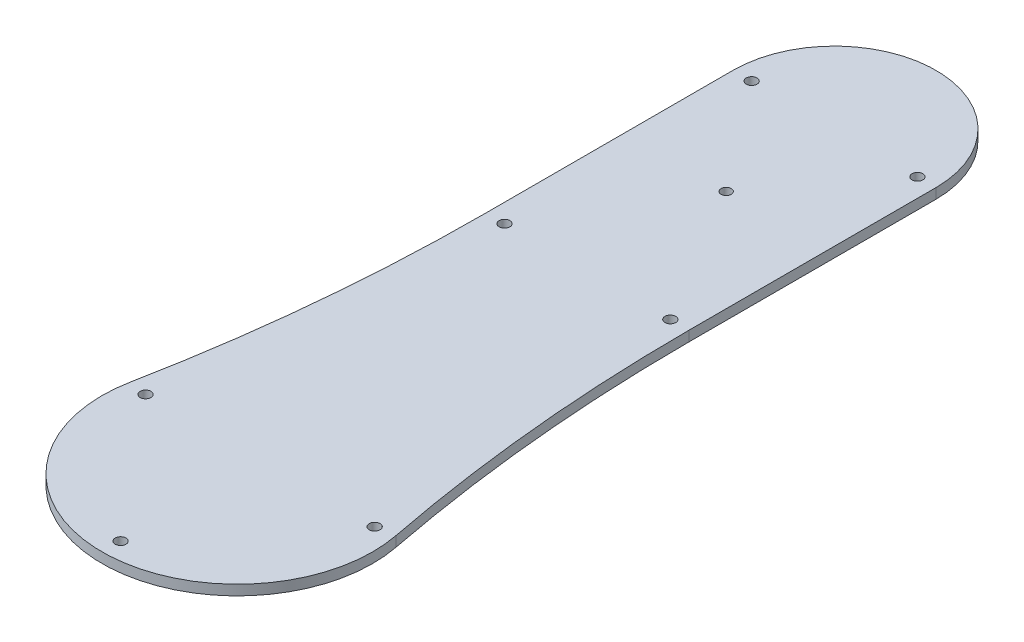
ISO-10303-21;
HEADER;
FILE_DESCRIPTION(('STEP AP214'),'2;1');
FILE_NAME('part.step','',(''),(''),'','','');
FILE_SCHEMA(('AUTOMOTIVE_DESIGN { 1 0 10303 214 1 1 1 1 }'));
ENDSEC;
DATA;
#1=APPLICATION_CONTEXT('core data for automotive mechanical design processes');
#2=APPLICATION_PROTOCOL_DEFINITION('international standard','automotive_design',2000,#1);
#3=PRODUCT_CONTEXT('',#1,'mechanical');
#4=PRODUCT('Part','Part','',(#3));
#5=PRODUCT_RELATED_PRODUCT_CATEGORY('part','',(#4));
#6=PRODUCT_DEFINITION_FORMATION('','',#4);
#7=PRODUCT_DEFINITION_CONTEXT('part definition',#1,'design');
#8=PRODUCT_DEFINITION('design','',#6,#7);
#9=PRODUCT_DEFINITION_SHAPE('','',#8);
#10=(LENGTH_UNIT() NAMED_UNIT(*) SI_UNIT(.MILLI.,.METRE.));
#11=(NAMED_UNIT(*) PLANE_ANGLE_UNIT() SI_UNIT($,.RADIAN.));
#12=(NAMED_UNIT(*) SI_UNIT($,.STERADIAN.) SOLID_ANGLE_UNIT());
#13=UNCERTAINTY_MEASURE_WITH_UNIT(LENGTH_MEASURE(1.E-05),#10,'distance_accuracy_value','');
#14=(GEOMETRIC_REPRESENTATION_CONTEXT(3) GLOBAL_UNCERTAINTY_ASSIGNED_CONTEXT((#13)) GLOBAL_UNIT_ASSIGNED_CONTEXT((#10,
#11,#12)) REPRESENTATION_CONTEXT('',''));
#15=CARTESIAN_POINT('',(0.,0.,0.));
#16=DIRECTION('',(0.,0.,1.));
#17=DIRECTION('',(1.,0.,0.));
#18=AXIS2_PLACEMENT_3D('',#15,#16,#17);
#19=CARTESIAN_POINT('',(-530.000000000004,3.,-103.440804327867));
#20=DIRECTION('',(0.,-1.,0.));
#21=DIRECTION('',(0.,0.,-1.));
#22=AXIS2_PLACEMENT_3D('',#19,#20,#21);
#23=CYLINDRICAL_SURFACE('',#22,500.);
#24=CARTESIAN_POINT('',(-530.000000000004,0.,-103.440804327867));
#25=DIRECTION('',(0.,-1.,0.));
#26=DIRECTION('',(0.,0.,-1.));
#27=AXIS2_PLACEMENT_3D('',#24,#25,#26);
#28=CIRCLE('',#27,500.);
#29=CARTESIAN_POINT('',(-30.0000000000037,0.,-103.440804327867));
#30=VERTEX_POINT('',#29);
#31=CARTESIAN_POINT('',(-39.2592592592595,0.,-7.66228180206424));
#32=VERTEX_POINT('',#31);
#33=EDGE_CURVE('E128',#30,#32,#28,.T.);
#34=ORIENTED_EDGE('',*,*,#33,.T.);
#35=DIRECTION('',(0.,-1.,0.));
#36=VECTOR('',#35,1.);
#37=CARTESIAN_POINT('',(-39.2592592592595,3.,-7.66228180206424));
#38=LINE('',#37,#36);
#39=CARTESIAN_POINT('',(-39.2592592592595,3.,-7.66228180206424));
#40=VERTEX_POINT('',#39);
#41=EDGE_CURVE('E11',#40,#32,#38,.T.);
#42=ORIENTED_EDGE('',*,*,#41,.F.);
#43=CARTESIAN_POINT('',(-530.000000000004,3.,-103.440804327867));
#44=DIRECTION('',(0.,-1.,0.));
#45=DIRECTION('',(0.,0.,-1.));
#46=AXIS2_PLACEMENT_3D('',#43,#44,#45);
#47=CIRCLE('',#46,500.);
#48=CARTESIAN_POINT('',(-30.0000000000037,3.,-103.440804327867));
#49=VERTEX_POINT('',#48);
#50=EDGE_CURVE('E139',#49,#40,#47,.T.);
#51=ORIENTED_EDGE('',*,*,#50,.F.);
#52=DIRECTION('',(0.,-1.,0.));
#53=VECTOR('',#52,1.);
#54=CARTESIAN_POINT('',(-30.0000000000037,3.,-103.440804327867));
#55=LINE('',#54,#53);
#56=EDGE_CURVE('E124',#49,#30,#55,.T.);
#57=ORIENTED_EDGE('',*,*,#56,.T.);
#58=EDGE_LOOP('',(#34,#42,#51,#57));
#59=FACE_BOUND('',#58,.T.);
#60=ADVANCED_FACE('F43',(#59),#23,.F.);
#61=CARTESIAN_POINT('',(0.,3.,0.));
#62=DIRECTION('',(0.,-1.,0.));
#63=DIRECTION('',(0.,0.,-1.));
#64=AXIS2_PLACEMENT_3D('',#61,#62,#63);
#65=CYLINDRICAL_SURFACE('',#64,40.);
#66=CARTESIAN_POINT('',(0.,0.,0.));
#67=DIRECTION('',(0.,1.,0.));
#68=DIRECTION('',(0.,0.,1.));
#69=AXIS2_PLACEMENT_3D('',#66,#67,#68);
#70=CIRCLE('',#69,40.);
#71=CARTESIAN_POINT('',(39.2592592592595,0.,-7.66228180206448));
#72=VERTEX_POINT('',#71);
#73=EDGE_CURVE('E131',#32,#72,#70,.T.);
#74=ORIENTED_EDGE('',*,*,#73,.T.);
#75=DIRECTION('',(0.,-1.,0.));
#76=VECTOR('',#75,1.);
#77=CARTESIAN_POINT('',(39.2592592592595,3.,-7.66228180206448));
#78=LINE('',#77,#76);
#79=CARTESIAN_POINT('',(39.2592592592595,3.,-7.66228180206448));
#80=VERTEX_POINT('',#79);
#81=EDGE_CURVE('E52',#80,#72,#78,.T.);
#82=ORIENTED_EDGE('',*,*,#81,.F.);
#83=CARTESIAN_POINT('',(0.,3.,0.));
#84=DIRECTION('',(0.,1.,0.));
#85=DIRECTION('',(0.,0.,1.));
#86=AXIS2_PLACEMENT_3D('',#83,#84,#85);
#87=CIRCLE('',#86,40.);
#88=EDGE_CURVE('E97',#40,#80,#87,.T.);
#89=ORIENTED_EDGE('',*,*,#88,.F.);
#90=ORIENTED_EDGE('',*,*,#41,.T.);
#91=EDGE_LOOP('',(#74,#82,#89,#90));
#92=FACE_BOUND('',#91,.T.);
#93=ADVANCED_FACE('F166',(#92),#65,.T.);
#94=CARTESIAN_POINT('',(530.000000000003,3.,-103.440804327872));
#95=DIRECTION('',(0.,-1.,0.));
#96=DIRECTION('',(0.,0.,-1.));
#97=AXIS2_PLACEMENT_3D('',#94,#95,#96);
#98=CYLINDRICAL_SURFACE('',#97,500.);
#99=CARTESIAN_POINT('',(530.000000000003,0.,-103.440804327872));
#100=DIRECTION('',(0.,-1.,0.));
#101=DIRECTION('',(0.,0.,-1.));
#102=AXIS2_PLACEMENT_3D('',#99,#100,#101);
#103=CIRCLE('',#102,500.);
#104=CARTESIAN_POINT('',(30.0000000000027,0.,-103.440804327872));
#105=VERTEX_POINT('',#104);
#106=EDGE_CURVE('E134',#72,#105,#103,.T.);
#107=ORIENTED_EDGE('',*,*,#106,.T.);
#108=DIRECTION('',(0.,-1.,0.));
#109=VECTOR('',#108,1.);
#110=CARTESIAN_POINT('',(30.0000000000027,3.,-103.440804327872));
#111=LINE('',#110,#109);
#112=CARTESIAN_POINT('',(30.0000000000027,3.,-103.440804327872));
#113=VERTEX_POINT('',#112);
#114=EDGE_CURVE('E119',#113,#105,#111,.T.);
#115=ORIENTED_EDGE('',*,*,#114,.F.);
#116=CARTESIAN_POINT('',(530.000000000003,3.,-103.440804327872));
#117=DIRECTION('',(0.,-1.,0.));
#118=DIRECTION('',(0.,0.,-1.));
#119=AXIS2_PLACEMENT_3D('',#116,#117,#118);
#120=CIRCLE('',#119,500.);
#121=EDGE_CURVE('E110',#80,#113,#120,.T.);
#122=ORIENTED_EDGE('',*,*,#121,.F.);
#123=ORIENTED_EDGE('',*,*,#81,.T.);
#124=EDGE_LOOP('',(#107,#115,#122,#123));
#125=FACE_BOUND('',#124,.T.);
#126=ADVANCED_FACE('F146',(#125),#98,.F.);
#127=CARTESIAN_POINT('',(30.0000000000027,3.,-176.457513110645));
#128=DIRECTION('',(-1.,0.,0.));
#129=DIRECTION('',(0.,0.,1.));
#130=AXIS2_PLACEMENT_3D('',#127,#128,#129);
#131=PLANE('',#130);
#132=DIRECTION('',(0.,0.,-1.));
#133=VECTOR('',#132,1.);
#134=CARTESIAN_POINT('',(30.0000000000027,0.,-176.457513110645));
#135=LINE('',#134,#133);
#136=CARTESIAN_POINT('',(30.0000000000039,0.,-176.457513110645));
#137=VERTEX_POINT('',#136);
#138=EDGE_CURVE('E118',#105,#137,#135,.T.);
#139=ORIENTED_EDGE('',*,*,#138,.T.);
#140=DIRECTION('',(0.,-1.,0.));
#141=VECTOR('',#140,1.);
#142=CARTESIAN_POINT('',(30.0000000000039,3.,-176.457513110645));
#143=LINE('',#142,#141);
#144=CARTESIAN_POINT('',(30.0000000000039,3.,-176.457513110645));
#145=VERTEX_POINT('',#144);
#146=EDGE_CURVE('E115',#145,#137,#143,.T.);
#147=ORIENTED_EDGE('',*,*,#146,.F.);
#148=DIRECTION('',(0.,0.,-1.));
#149=VECTOR('',#148,1.);
#150=CARTESIAN_POINT('',(30.0000000000027,3.,-176.457513110645));
#151=LINE('',#150,#149);
#152=EDGE_CURVE('E104',#113,#145,#151,.T.);
#153=ORIENTED_EDGE('',*,*,#152,.F.);
#154=ORIENTED_EDGE('',*,*,#114,.T.);
#155=EDGE_LOOP('',(#139,#147,#153,#154));
#156=FACE_BOUND('',#155,.T.);
#157=ADVANCED_FACE('F116',(#156),#131,.F.);
#158=CARTESIAN_POINT('',(7.32378567513958E-13,3.,-176.457513110645));
#159=DIRECTION('',(0.,-1.,0.));
#160=DIRECTION('',(0.,0.,-1.));
#161=AXIS2_PLACEMENT_3D('',#158,#159,#160);
#162=CYLINDRICAL_SURFACE('',#161,30.0000000000032);
#163=CARTESIAN_POINT('',(7.32378567513958E-13,0.,-176.457513110645));
#164=DIRECTION('',(0.,1.,0.));
#165=DIRECTION('',(0.,0.,1.));
#166=AXIS2_PLACEMENT_3D('',#163,#164,#165);
#167=CIRCLE('',#166,30.0000000000032);
#168=CARTESIAN_POINT('',(-30.0000000000037,0.,-176.457513110645));
#169=VERTEX_POINT('',#168);
#170=EDGE_CURVE('E83',#137,#169,#167,.T.);
#171=ORIENTED_EDGE('',*,*,#170,.T.);
#172=DIRECTION('',(0.,-1.,0.));
#173=VECTOR('',#172,1.);
#174=CARTESIAN_POINT('',(-30.0000000000037,3.,-176.457513110645));
#175=LINE('',#174,#173);
#176=CARTESIAN_POINT('',(-30.0000000000037,3.,-176.457513110645));
#177=VERTEX_POINT('',#176);
#178=EDGE_CURVE('E120',#177,#169,#175,.T.);
#179=ORIENTED_EDGE('',*,*,#178,.F.);
#180=CARTESIAN_POINT('',(7.32378567513958E-13,3.,-176.457513110645));
#181=DIRECTION('',(0.,1.,0.));
#182=DIRECTION('',(0.,0.,1.));
#183=AXIS2_PLACEMENT_3D('',#180,#181,#182);
#184=CIRCLE('',#183,30.0000000000032);
#185=EDGE_CURVE('E108',#145,#177,#184,.T.);
#186=ORIENTED_EDGE('',*,*,#185,.F.);
#187=ORIENTED_EDGE('',*,*,#146,.T.);
#188=EDGE_LOOP('',(#171,#179,#186,#187));
#189=FACE_BOUND('',#188,.T.);
#190=ADVANCED_FACE('F122',(#189),#162,.T.);
#191=CARTESIAN_POINT('',(-30.0000000000037,3.,-176.457513110645));
#192=DIRECTION('',(1.,0.,0.));
#193=DIRECTION('',(0.,0.,-1.));
#194=AXIS2_PLACEMENT_3D('',#191,#192,#193);
#195=PLANE('',#194);
#196=DIRECTION('',(0.,0.,1.));
#197=VECTOR('',#196,1.);
#198=CARTESIAN_POINT('',(-30.0000000000037,0.,-176.457513110645));
#199=LINE('',#198,#197);
#200=EDGE_CURVE('E89',#169,#30,#199,.T.);
#201=ORIENTED_EDGE('',*,*,#200,.T.);
#202=ORIENTED_EDGE('',*,*,#56,.F.);
#203=DIRECTION('',(0.,0.,1.));
#204=VECTOR('',#203,1.);
#205=CARTESIAN_POINT('',(-30.0000000000037,3.,-176.457513110645));
#206=LINE('',#205,#204);
#207=EDGE_CURVE('E60',#177,#49,#206,.T.);
#208=ORIENTED_EDGE('',*,*,#207,.F.);
#209=ORIENTED_EDGE('',*,*,#178,.T.);
#210=EDGE_LOOP('',(#201,#202,#208,#209));
#211=FACE_BOUND('',#210,.T.);
#212=ADVANCED_FACE('F153',(#211),#195,.F.);
#213=CARTESIAN_POINT('',(-530.000000000004,3.,-103.440804327867));
#214=DIRECTION('',(0.,-1.,0.));
#215=DIRECTION('',(0.,0.,-1.));
#216=AXIS2_PLACEMENT_3D('',#213,#214,#215);
#217=PLANE('',#216);
#218=CARTESIAN_POINT('',(1.08492693112868E-11,3.,-144.457513110647));
#219=DIRECTION('',(0.,1.,0.));
#220=DIRECTION('',(0.,0.,1.));
#221=AXIS2_PLACEMENT_3D('',#218,#219,#220);
#222=CIRCLE('',#221,1.5);
#223=CARTESIAN_POINT('',(1.08492693112868E-11,3.,-142.957513110647));
#224=VERTEX_POINT('',#223);
#225=EDGE_CURVE('E336',#224,#224,#222,.T.);
#226=ORIENTED_EDGE('',*,*,#225,.F.);
#227=EDGE_LOOP('',(#226));
#228=FACE_BOUND('',#227,.T.);
#229=CARTESIAN_POINT('',(6.57785458046956E-13,3.,34.5000000000004));
#230=DIRECTION('',(0.,1.,0.));
#231=DIRECTION('',(0.,0.,1.));
#232=AXIS2_PLACEMENT_3D('',#229,#230,#231);
#233=CIRCLE('',#232,1.6);
#234=CARTESIAN_POINT('',(6.57785458046956E-13,3.,36.1000000000004));
#235=VERTEX_POINT('',#234);
#236=EDGE_CURVE('E342',#235,#235,#233,.T.);
#237=ORIENTED_EDGE('',*,*,#236,.F.);
#238=EDGE_LOOP('',(#237));
#239=FACE_BOUND('',#238,.T.);
#240=CARTESIAN_POINT('',(-33.8424630414574,3.,-6.73080903707531));
#241=DIRECTION('',(0.,1.,0.));
#242=DIRECTION('',(0.,0.,-1.));
#243=AXIS2_PLACEMENT_3D('',#240,#241,#242);
#244=CIRCLE('',#243,1.6);
#245=CARTESIAN_POINT('',(-33.8424630414574,3.,-8.3308090370753));
#246=VERTEX_POINT('',#245);
#247=EDGE_CURVE('E353',#246,#246,#244,.T.);
#248=ORIENTED_EDGE('',*,*,#247,.F.);
#249=EDGE_LOOP('',(#248));
#250=FACE_BOUND('',#249,.T.);
#251=CARTESIAN_POINT('',(-24.5000544134384,3.,-103.453580765304));
#252=DIRECTION('',(0.,1.,0.));
#253=DIRECTION('',(0.,0.,-1.));
#254=AXIS2_PLACEMENT_3D('',#251,#252,#253);
#255=CIRCLE('',#254,1.6);
#256=CARTESIAN_POINT('',(-24.5000544134384,3.,-105.053580765304));
#257=VERTEX_POINT('',#256);
#258=EDGE_CURVE('E346',#257,#257,#255,.T.);
#259=ORIENTED_EDGE('',*,*,#258,.F.);
#260=EDGE_LOOP('',(#259));
#261=FACE_BOUND('',#260,.T.);
#262=CARTESIAN_POINT('',(-24.5000435594557,3.,-176.468944491205));
#263=DIRECTION('',(0.,1.,0.));
#264=DIRECTION('',(0.,0.,-1.));
#265=AXIS2_PLACEMENT_3D('',#262,#263,#264);
#266=CIRCLE('',#265,1.6);
#267=CARTESIAN_POINT('',(-24.5000435594557,3.,-178.068944491205));
#268=VERTEX_POINT('',#267);
#269=EDGE_CURVE('E375',#268,#268,#266,.T.);
#270=ORIENTED_EDGE('',*,*,#269,.F.);
#271=EDGE_LOOP('',(#270));
#272=FACE_BOUND('',#271,.T.);
#273=CARTESIAN_POINT('',(24.5000435594556,3.,-176.468944491205));
#274=DIRECTION('',(0.,1.,0.));
#275=DIRECTION('',(0.,0.,1.));
#276=AXIS2_PLACEMENT_3D('',#273,#274,#275);
#277=CIRCLE('',#276,1.6);
#278=CARTESIAN_POINT('',(24.5000435594556,3.,-174.868944491205));
#279=VERTEX_POINT('',#278);
#280=EDGE_CURVE('E369',#279,#279,#277,.T.);
#281=ORIENTED_EDGE('',*,*,#280,.F.);
#282=EDGE_LOOP('',(#281));
#283=FACE_BOUND('',#282,.T.);
#284=CARTESIAN_POINT('',(24.5000544134383,3.,-103.453580765304));
#285=DIRECTION('',(0.,1.,0.));
#286=DIRECTION('',(0.,0.,1.));
#287=AXIS2_PLACEMENT_3D('',#284,#285,#286);
#288=CIRCLE('',#287,1.6);
#289=CARTESIAN_POINT('',(24.5000544134383,3.,-101.853580765304));
#290=VERTEX_POINT('',#289);
#291=EDGE_CURVE('E363',#290,#290,#288,.T.);
#292=ORIENTED_EDGE('',*,*,#291,.F.);
#293=EDGE_LOOP('',(#292));
#294=FACE_BOUND('',#293,.T.);
#295=CARTESIAN_POINT('',(33.8424630414574,3.,-6.73080903707532));
#296=DIRECTION('',(0.,1.,0.));
#297=DIRECTION('',(0.,0.,1.));
#298=AXIS2_PLACEMENT_3D('',#295,#296,#297);
#299=CIRCLE('',#298,1.6);
#300=CARTESIAN_POINT('',(33.8424630414574,3.,-5.13080903707532));
#301=VERTEX_POINT('',#300);
#302=EDGE_CURVE('E345',#301,#301,#299,.T.);
#303=ORIENTED_EDGE('',*,*,#302,.F.);
#304=EDGE_LOOP('',(#303));
#305=FACE_BOUND('',#304,.T.);
#306=ORIENTED_EDGE('',*,*,#50,.T.);
#307=ORIENTED_EDGE('',*,*,#88,.T.);
#308=ORIENTED_EDGE('',*,*,#121,.T.);
#309=ORIENTED_EDGE('',*,*,#152,.T.);
#310=ORIENTED_EDGE('',*,*,#185,.T.);
#311=ORIENTED_EDGE('',*,*,#207,.T.);
#312=EDGE_LOOP('',(#306,#307,#308,#309,#310,#311));
#313=FACE_BOUND('',#312,.T.);
#314=ADVANCED_FACE('F106',(#228,#239,#250,#261,#272,#283,#294,#305,#313),#217,.F.);
#315=CARTESIAN_POINT('',(-530.000000000004,0.,-103.440804327867));
#316=DIRECTION('',(0.,-1.,0.));
#317=DIRECTION('',(0.,0.,-1.));
#318=AXIS2_PLACEMENT_3D('',#315,#316,#317);
#319=PLANE('',#318);
#320=CARTESIAN_POINT('',(1.08492693112868E-11,0.,-144.457513110647));
#321=DIRECTION('',(0.,-1.,0.));
#322=DIRECTION('',(0.,0.,-1.));
#323=AXIS2_PLACEMENT_3D('',#320,#321,#322);
#324=CIRCLE('',#323,1.5);
#325=CARTESIAN_POINT('',(1.08492693112868E-11,0.,-145.957513110647));
#326=VERTEX_POINT('',#325);
#327=EDGE_CURVE('E46',#326,#326,#324,.T.);
#328=ORIENTED_EDGE('',*,*,#327,.F.);
#329=EDGE_LOOP('',(#328));
#330=FACE_BOUND('',#329,.T.);
#331=CARTESIAN_POINT('',(6.57785458046956E-13,0.,34.5000000000004));
#332=DIRECTION('',(0.,1.,0.));
#333=DIRECTION('',(0.,0.,1.));
#334=AXIS2_PLACEMENT_3D('',#331,#332,#333);
#335=CIRCLE('',#334,1.6);
#336=CARTESIAN_POINT('',(6.57785458046956E-13,0.,36.1000000000004));
#337=VERTEX_POINT('',#336);
#338=EDGE_CURVE('E132',#337,#337,#335,.T.);
#339=ORIENTED_EDGE('',*,*,#338,.T.);
#340=EDGE_LOOP('',(#339));
#341=FACE_BOUND('',#340,.T.);
#342=CARTESIAN_POINT('',(-33.8424630414574,0.,-6.73080903707531));
#343=DIRECTION('',(0.,1.,0.));
#344=DIRECTION('',(0.,0.,-1.));
#345=AXIS2_PLACEMENT_3D('',#342,#343,#344);
#346=CIRCLE('',#345,1.6);
#347=CARTESIAN_POINT('',(-33.8424630414574,0.,-8.3308090370753));
#348=VERTEX_POINT('',#347);
#349=EDGE_CURVE('E338',#348,#348,#346,.T.);
#350=ORIENTED_EDGE('',*,*,#349,.T.);
#351=EDGE_LOOP('',(#350));
#352=FACE_BOUND('',#351,.T.);
#353=CARTESIAN_POINT('',(-24.5000544134384,0.,-103.453580765304));
#354=DIRECTION('',(0.,1.,0.));
#355=DIRECTION('',(0.,0.,-1.));
#356=AXIS2_PLACEMENT_3D('',#353,#354,#355);
#357=CIRCLE('',#356,1.6);
#358=CARTESIAN_POINT('',(-24.5000544134384,0.,-105.053580765304));
#359=VERTEX_POINT('',#358);
#360=EDGE_CURVE('E350',#359,#359,#357,.T.);
#361=ORIENTED_EDGE('',*,*,#360,.T.);
#362=EDGE_LOOP('',(#361));
#363=FACE_BOUND('',#362,.T.);
#364=CARTESIAN_POINT('',(-24.5000435594557,0.,-176.468944491205));
#365=DIRECTION('',(0.,1.,0.));
#366=DIRECTION('',(0.,0.,-1.));
#367=AXIS2_PLACEMENT_3D('',#364,#365,#366);
#368=CIRCLE('',#367,1.6);
#369=CARTESIAN_POINT('',(-24.5000435594557,0.,-178.068944491205));
#370=VERTEX_POINT('',#369);
#371=EDGE_CURVE('E349',#370,#370,#368,.T.);
#372=ORIENTED_EDGE('',*,*,#371,.T.);
#373=EDGE_LOOP('',(#372));
#374=FACE_BOUND('',#373,.T.);
#375=CARTESIAN_POINT('',(24.5000435594556,0.,-176.468944491205));
#376=DIRECTION('',(0.,1.,0.));
#377=DIRECTION('',(0.,0.,1.));
#378=AXIS2_PLACEMENT_3D('',#375,#376,#377);
#379=CIRCLE('',#378,1.6);
#380=CARTESIAN_POINT('',(24.5000435594556,0.,-174.868944491205));
#381=VERTEX_POINT('',#380);
#382=EDGE_CURVE('E372',#381,#381,#379,.T.);
#383=ORIENTED_EDGE('',*,*,#382,.T.);
#384=EDGE_LOOP('',(#383));
#385=FACE_BOUND('',#384,.T.);
#386=CARTESIAN_POINT('',(24.5000544134383,0.,-103.453580765304));
#387=DIRECTION('',(0.,1.,0.));
#388=DIRECTION('',(0.,0.,1.));
#389=AXIS2_PLACEMENT_3D('',#386,#387,#388);
#390=CIRCLE('',#389,1.6);
#391=CARTESIAN_POINT('',(24.5000544134383,0.,-101.853580765304));
#392=VERTEX_POINT('',#391);
#393=EDGE_CURVE('E366',#392,#392,#390,.T.);
#394=ORIENTED_EDGE('',*,*,#393,.T.);
#395=EDGE_LOOP('',(#394));
#396=FACE_BOUND('',#395,.T.);
#397=CARTESIAN_POINT('',(33.8424630414574,0.,-6.73080903707532));
#398=DIRECTION('',(0.,1.,0.));
#399=DIRECTION('',(0.,0.,1.));
#400=AXIS2_PLACEMENT_3D('',#397,#398,#399);
#401=CIRCLE('',#400,1.6);
#402=CARTESIAN_POINT('',(33.8424630414574,0.,-5.13080903707532));
#403=VERTEX_POINT('',#402);
#404=EDGE_CURVE('E360',#403,#403,#401,.T.);
#405=ORIENTED_EDGE('',*,*,#404,.T.);
#406=EDGE_LOOP('',(#405));
#407=FACE_BOUND('',#406,.T.);
#408=ORIENTED_EDGE('',*,*,#33,.F.);
#409=ORIENTED_EDGE('',*,*,#200,.F.);
#410=ORIENTED_EDGE('',*,*,#170,.F.);
#411=ORIENTED_EDGE('',*,*,#138,.F.);
#412=ORIENTED_EDGE('',*,*,#106,.F.);
#413=ORIENTED_EDGE('',*,*,#73,.F.);
#414=EDGE_LOOP('',(#408,#409,#410,#411,#412,#413));
#415=FACE_BOUND('',#414,.T.);
#416=ADVANCED_FACE('F149',(#330,#341,#352,#363,#374,#385,#396,#407,#415),#319,.T.);
#417=CARTESIAN_POINT('',(33.8424630414574,0.,-6.73080903707532));
#418=DIRECTION('',(0.,1.,0.));
#419=DIRECTION('',(0.,0.,1.));
#420=AXIS2_PLACEMENT_3D('',#417,#418,#419);
#421=CYLINDRICAL_SURFACE('',#420,1.6);
#422=ORIENTED_EDGE('',*,*,#404,.F.);
#423=EDGE_LOOP('',(#422));
#424=FACE_BOUND('',#423,.T.);
#425=ORIENTED_EDGE('',*,*,#302,.T.);
#426=EDGE_LOOP('',(#425));
#427=FACE_BOUND('',#426,.T.);
#428=ADVANCED_FACE('F196',(#424,#427),#421,.F.);
#429=CARTESIAN_POINT('',(24.5000544134383,0.,-103.453580765304));
#430=DIRECTION('',(0.,1.,0.));
#431=DIRECTION('',(0.,0.,1.));
#432=AXIS2_PLACEMENT_3D('',#429,#430,#431);
#433=CYLINDRICAL_SURFACE('',#432,1.6);
#434=ORIENTED_EDGE('',*,*,#393,.F.);
#435=EDGE_LOOP('',(#434));
#436=FACE_BOUND('',#435,.T.);
#437=ORIENTED_EDGE('',*,*,#291,.T.);
#438=EDGE_LOOP('',(#437));
#439=FACE_BOUND('',#438,.T.);
#440=ADVANCED_FACE('F201',(#436,#439),#433,.F.);
#441=CARTESIAN_POINT('',(24.5000435594556,0.,-176.468944491205));
#442=DIRECTION('',(0.,1.,0.));
#443=DIRECTION('',(0.,0.,1.));
#444=AXIS2_PLACEMENT_3D('',#441,#442,#443);
#445=CYLINDRICAL_SURFACE('',#444,1.6);
#446=ORIENTED_EDGE('',*,*,#382,.F.);
#447=EDGE_LOOP('',(#446));
#448=FACE_BOUND('',#447,.T.);
#449=ORIENTED_EDGE('',*,*,#280,.T.);
#450=EDGE_LOOP('',(#449));
#451=FACE_BOUND('',#450,.T.);
#452=ADVANCED_FACE('F214',(#448,#451),#445,.F.);
#453=CARTESIAN_POINT('',(-24.5000435594557,0.,-176.468944491205));
#454=DIRECTION('',(0.,1.,0.));
#455=DIRECTION('',(0.,0.,1.));
#456=AXIS2_PLACEMENT_3D('',#453,#454,#455);
#457=CYLINDRICAL_SURFACE('',#456,1.6);
#458=ORIENTED_EDGE('',*,*,#371,.F.);
#459=EDGE_LOOP('',(#458));
#460=FACE_BOUND('',#459,.T.);
#461=ORIENTED_EDGE('',*,*,#269,.T.);
#462=EDGE_LOOP('',(#461));
#463=FACE_BOUND('',#462,.T.);
#464=ADVANCED_FACE('F225',(#460,#463),#457,.F.);
#465=CARTESIAN_POINT('',(-24.5000544134384,0.,-103.453580765304));
#466=DIRECTION('',(0.,1.,0.));
#467=DIRECTION('',(0.,0.,1.));
#468=AXIS2_PLACEMENT_3D('',#465,#466,#467);
#469=CYLINDRICAL_SURFACE('',#468,1.6);
#470=ORIENTED_EDGE('',*,*,#360,.F.);
#471=EDGE_LOOP('',(#470));
#472=FACE_BOUND('',#471,.T.);
#473=ORIENTED_EDGE('',*,*,#258,.T.);
#474=EDGE_LOOP('',(#473));
#475=FACE_BOUND('',#474,.T.);
#476=ADVANCED_FACE('F236',(#472,#475),#469,.F.);
#477=CARTESIAN_POINT('',(-33.8424630414574,0.,-6.73080903707531));
#478=DIRECTION('',(0.,1.,0.));
#479=DIRECTION('',(0.,0.,1.));
#480=AXIS2_PLACEMENT_3D('',#477,#478,#479);
#481=CYLINDRICAL_SURFACE('',#480,1.6);
#482=ORIENTED_EDGE('',*,*,#349,.F.);
#483=EDGE_LOOP('',(#482));
#484=FACE_BOUND('',#483,.T.);
#485=ORIENTED_EDGE('',*,*,#247,.T.);
#486=EDGE_LOOP('',(#485));
#487=FACE_BOUND('',#486,.T.);
#488=ADVANCED_FACE('F247',(#484,#487),#481,.F.);
#489=CARTESIAN_POINT('',(6.57785458046956E-13,0.,34.5000000000004));
#490=DIRECTION('',(0.,1.,0.));
#491=DIRECTION('',(0.,0.,1.));
#492=AXIS2_PLACEMENT_3D('',#489,#490,#491);
#493=CYLINDRICAL_SURFACE('',#492,1.6);
#494=ORIENTED_EDGE('',*,*,#338,.F.);
#495=EDGE_LOOP('',(#494));
#496=FACE_BOUND('',#495,.T.);
#497=ORIENTED_EDGE('',*,*,#236,.T.);
#498=EDGE_LOOP('',(#497));
#499=FACE_BOUND('',#498,.T.);
#500=ADVANCED_FACE('F258',(#496,#499),#493,.F.);
#501=CARTESIAN_POINT('',(1.08492693112868E-11,-7.,-144.457513110647));
#502=DIRECTION('',(0.,1.,0.));
#503=DIRECTION('',(0.,0.,1.));
#504=AXIS2_PLACEMENT_3D('',#501,#502,#503);
#505=CYLINDRICAL_SURFACE('',#504,1.5);
#506=ORIENTED_EDGE('',*,*,#327,.T.);
#507=EDGE_LOOP('',(#506));
#508=FACE_BOUND('',#507,.T.);
#509=ORIENTED_EDGE('',*,*,#225,.T.);
#510=EDGE_LOOP('',(#509));
#511=FACE_BOUND('',#510,.T.);
#512=ADVANCED_FACE('F268',(#508,#511),#505,.F.);
#513=CLOSED_SHELL('',(#60,#93,#126,#157,#190,#212,#314,#416,#428,#440,#452,#464,#476,#488,#500,#512));
#514=MANIFOLD_SOLID_BREP('B2',#513);
#515=ADVANCED_BREP_SHAPE_REPRESENTATION('',(#18,#514),#14);
#516=SHAPE_DEFINITION_REPRESENTATION(#9,#515);
ENDSEC;
END-ISO-10303-21;
